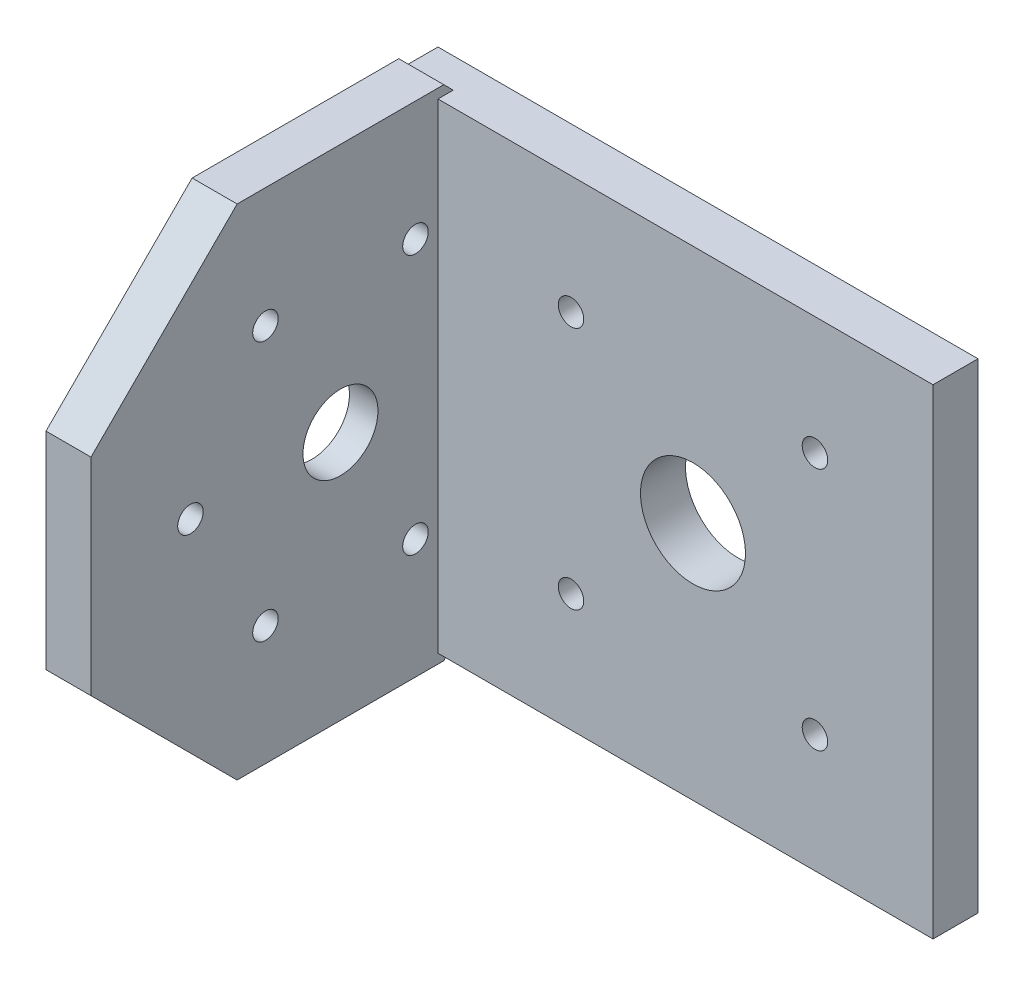
ISO-10303-21;
HEADER;
FILE_DESCRIPTION(('STEP AP214'),'2;1');
FILE_NAME('part.step','',(''),(''),'','','');
FILE_SCHEMA(('AUTOMOTIVE_DESIGN { 1 0 10303 214 1 1 1 1 }'));
ENDSEC;
DATA;
#1=APPLICATION_CONTEXT('core data for automotive mechanical design processes');
#2=APPLICATION_PROTOCOL_DEFINITION('international standard','automotive_design',2000,#1);
#3=PRODUCT_CONTEXT('',#1,'mechanical');
#4=PRODUCT('Part','Part','',(#3));
#5=PRODUCT_RELATED_PRODUCT_CATEGORY('part','',(#4));
#6=PRODUCT_DEFINITION_FORMATION('','',#4);
#7=PRODUCT_DEFINITION_CONTEXT('part definition',#1,'design');
#8=PRODUCT_DEFINITION('design','',#6,#7);
#9=PRODUCT_DEFINITION_SHAPE('','',#8);
#10=(LENGTH_UNIT() NAMED_UNIT(*) SI_UNIT(.MILLI.,.METRE.));
#11=(NAMED_UNIT(*) PLANE_ANGLE_UNIT() SI_UNIT($,.RADIAN.));
#12=(NAMED_UNIT(*) SI_UNIT($,.STERADIAN.) SOLID_ANGLE_UNIT());
#13=UNCERTAINTY_MEASURE_WITH_UNIT(LENGTH_MEASURE(1.E-05),#10,'distance_accuracy_value','');
#14=(GEOMETRIC_REPRESENTATION_CONTEXT(3) GLOBAL_UNCERTAINTY_ASSIGNED_CONTEXT((#13)) GLOBAL_UNIT_ASSIGNED_CONTEXT((#10,
#11,#12)) REPRESENTATION_CONTEXT('',''));
#15=CARTESIAN_POINT('',(0.,0.,0.));
#16=DIRECTION('',(0.,0.,1.));
#17=DIRECTION('',(1.,0.,0.));
#18=AXIS2_PLACEMENT_3D('',#15,#16,#17);
#19=CARTESIAN_POINT('',(-34.,0.,0.));
#20=DIRECTION('',(1.,0.,0.));
#21=DIRECTION('',(0.,0.,-1.));
#22=AXIS2_PLACEMENT_3D('',#19,#20,#21);
#23=PLANE('',#22);
#24=DIRECTION('',(0.,0.707106781186547,0.707106781186548));
#25=VECTOR('',#24,1.);
#26=CARTESIAN_POINT('',(-34.,13.7766035651432,-33.2596631704063));
#27=LINE('',#26,#25);
#28=CARTESIAN_POINT('',(-34.,13.7766035651432,-33.2596631704063));
#29=VERTEX_POINT('',#28);
#30=CARTESIAN_POINT('',(-34.,28.0362667355495,-19.));
#31=VERTEX_POINT('',#30);
#32=EDGE_CURVE('E147',#29,#31,#27,.T.);
#33=ORIENTED_EDGE('',*,*,#32,.T.);
#34=DIRECTION('',(0.,-1.,0.));
#35=VECTOR('',#34,1.);
#36=CARTESIAN_POINT('',(-34.,0.,-19.));
#37=LINE('',#36,#35);
#38=CARTESIAN_POINT('',(-34.,1.37477270848675,-19.));
#39=VERTEX_POINT('',#38);
#40=EDGE_CURVE('E269',#31,#39,#37,.T.);
#41=ORIENTED_EDGE('',*,*,#40,.T.);
#42=CARTESIAN_POINT('',(-34.,0.,-20.));
#43=DIRECTION('',(1.,0.,0.));
#44=DIRECTION('',(0.,0.,-1.));
#45=AXIS2_PLACEMENT_3D('',#42,#43,#44);
#46=CIRCLE('',#45,1.7);
#47=CARTESIAN_POINT('',(-34.,-1.37477270848675,-19.));
#48=VERTEX_POINT('',#47);
#49=EDGE_CURVE('E159',#48,#39,#46,.T.);
#50=ORIENTED_EDGE('',*,*,#49,.F.);
#51=CARTESIAN_POINT('',(-34.,-28.0362667355495,-19.));
#52=VERTEX_POINT('',#51);
#53=EDGE_CURVE('E54',#48,#52,#37,.T.);
#54=ORIENTED_EDGE('',*,*,#53,.T.);
#55=DIRECTION('',(0.,0.707106781186548,-0.707106781186547));
#56=VECTOR('',#55,1.);
#57=CARTESIAN_POINT('',(-34.,-33.2596631704063,-13.7766035651432));
#58=LINE('',#57,#56);
#59=CARTESIAN_POINT('',(-34.,-13.7766035651432,-33.2596631704063));
#60=VERTEX_POINT('',#59);
#61=EDGE_CURVE('E124',#52,#60,#58,.T.);
#62=ORIENTED_EDGE('',*,*,#61,.T.);
#63=DIRECTION('',(0.,1.,0.));
#64=VECTOR('',#63,1.);
#65=CARTESIAN_POINT('',(-34.,-13.7766035651432,-33.2596631704063));
#66=LINE('',#65,#64);
#67=EDGE_CURVE('E130',#60,#29,#66,.T.);
#68=ORIENTED_EDGE('',*,*,#67,.T.);
#69=EDGE_LOOP('',(#33,#41,#50,#54,#62,#68));
#70=FACE_BOUND('',#69,.T.);
#71=ADVANCED_FACE('F39',(#70),#23,.T.);
#72=CARTESIAN_POINT('',(-34.,0.,0.));
#73=DIRECTION('',(1.,0.,0.));
#74=DIRECTION('',(0.,0.,-1.));
#75=AXIS2_PLACEMENT_3D('',#72,#73,#74);
#76=CIRCLE('',#75,5.);
#77=CARTESIAN_POINT('',(-34.,0.,-5.));
#78=VERTEX_POINT('',#77);
#79=EDGE_CURVE('E284',#78,#78,#76,.T.);
#80=ORIENTED_EDGE('',*,*,#79,.F.);
#81=EDGE_LOOP('',(#80));
#82=FACE_BOUND('',#81,.T.);
#83=CARTESIAN_POINT('',(-34.,-17.3205080756888,10.));
#84=DIRECTION('',(1.,0.,0.));
#85=DIRECTION('',(0.,0.,-1.));
#86=AXIS2_PLACEMENT_3D('',#83,#84,#85);
#87=CIRCLE('',#86,1.7);
#88=CARTESIAN_POINT('',(-34.,-17.3205080756888,8.30000000000001));
#89=VERTEX_POINT('',#88);
#90=EDGE_CURVE('E292',#89,#89,#87,.T.);
#91=ORIENTED_EDGE('',*,*,#90,.F.);
#92=EDGE_LOOP('',(#91));
#93=FACE_BOUND('',#92,.T.);
#94=CARTESIAN_POINT('',(-34.,17.3205080756888,9.99999999999999));
#95=DIRECTION('',(1.,0.,0.));
#96=DIRECTION('',(0.,0.,-1.));
#97=AXIS2_PLACEMENT_3D('',#94,#95,#96);
#98=CIRCLE('',#97,1.7);
#99=CARTESIAN_POINT('',(-34.,17.3205080756888,8.3));
#100=VERTEX_POINT('',#99);
#101=EDGE_CURVE('E304',#100,#100,#98,.T.);
#102=ORIENTED_EDGE('',*,*,#101,.F.);
#103=EDGE_LOOP('',(#102));
#104=FACE_BOUND('',#103,.T.);
#105=CARTESIAN_POINT('',(-34.,17.3205080756888,-10.));
#106=DIRECTION('',(1.,0.,0.));
#107=DIRECTION('',(0.,0.,-1.));
#108=AXIS2_PLACEMENT_3D('',#105,#106,#107);
#109=CIRCLE('',#108,1.7);
#110=CARTESIAN_POINT('',(-34.,17.3205080756888,-11.7));
#111=VERTEX_POINT('',#110);
#112=EDGE_CURVE('E310',#111,#111,#109,.T.);
#113=ORIENTED_EDGE('',*,*,#112,.F.);
#114=EDGE_LOOP('',(#113));
#115=FACE_BOUND('',#114,.T.);
#116=CARTESIAN_POINT('',(-34.,0.,20.));
#117=DIRECTION('',(1.,0.,0.));
#118=DIRECTION('',(0.,0.,-1.));
#119=AXIS2_PLACEMENT_3D('',#116,#117,#118);
#120=CIRCLE('',#119,1.7);
#121=CARTESIAN_POINT('',(-34.,0.,18.3));
#122=VERTEX_POINT('',#121);
#123=EDGE_CURVE('E296',#122,#122,#120,.T.);
#124=ORIENTED_EDGE('',*,*,#123,.F.);
#125=EDGE_LOOP('',(#124));
#126=FACE_BOUND('',#125,.T.);
#127=CARTESIAN_POINT('',(-34.,-17.3205080756888,-10.));
#128=DIRECTION('',(1.,0.,0.));
#129=DIRECTION('',(0.,0.,-1.));
#130=AXIS2_PLACEMENT_3D('',#127,#128,#129);
#131=CIRCLE('',#130,1.7);
#132=CARTESIAN_POINT('',(-34.,-17.3205080756888,-11.7));
#133=VERTEX_POINT('',#132);
#134=EDGE_CURVE('E282',#133,#133,#131,.T.);
#135=ORIENTED_EDGE('',*,*,#134,.F.);
#136=EDGE_LOOP('',(#135));
#137=FACE_BOUND('',#136,.T.);
#138=CARTESIAN_POINT('',(-34.,-33.2596631704063,-13.7766035651432));
#139=VERTEX_POINT('',#138);
#140=CARTESIAN_POINT('',(-34.,-32.,-15.0362667355495));
#141=VERTEX_POINT('',#140);
#142=EDGE_CURVE('E135',#139,#141,#58,.T.);
#143=ORIENTED_EDGE('',*,*,#142,.T.);
#144=DIRECTION('',(0.,0.,1.));
#145=VECTOR('',#144,1.);
#146=CARTESIAN_POINT('',(-34.,-32.,0.));
#147=LINE('',#146,#145);
#148=CARTESIAN_POINT('',(-34.,-32.,-13.));
#149=VERTEX_POINT('',#148);
#150=EDGE_CURVE('E217',#141,#149,#147,.T.);
#151=ORIENTED_EDGE('',*,*,#150,.T.);
#152=DIRECTION('',(0.,-1.,0.));
#153=VECTOR('',#152,1.);
#154=CARTESIAN_POINT('',(-34.,0.,-13.));
#155=LINE('',#154,#153);
#156=CARTESIAN_POINT('',(-34.,32.,-13.));
#157=VERTEX_POINT('',#156);
#158=EDGE_CURVE('E220',#157,#149,#155,.T.);
#159=ORIENTED_EDGE('',*,*,#158,.F.);
#160=DIRECTION('',(0.,0.,-1.));
#161=VECTOR('',#160,1.);
#162=CARTESIAN_POINT('',(-34.,32.,0.));
#163=LINE('',#162,#161);
#164=CARTESIAN_POINT('',(-34.,32.,-15.0362667355495));
#165=VERTEX_POINT('',#164);
#166=EDGE_CURVE('E202',#157,#165,#163,.T.);
#167=ORIENTED_EDGE('',*,*,#166,.T.);
#168=CARTESIAN_POINT('',(-34.,33.2596631704063,-13.7766035651432));
#169=VERTEX_POINT('',#168);
#170=EDGE_CURVE('E63',#165,#169,#27,.T.);
#171=ORIENTED_EDGE('',*,*,#170,.T.);
#172=DIRECTION('',(0.,0.,1.));
#173=VECTOR('',#172,1.);
#174=CARTESIAN_POINT('',(-34.,33.2596631704063,-13.7766035651432));
#175=LINE('',#174,#173);
#176=CARTESIAN_POINT('',(-34.,33.2596631704063,13.7766035651432));
#177=VERTEX_POINT('',#176);
#178=EDGE_CURVE('E177',#169,#177,#175,.T.);
#179=ORIENTED_EDGE('',*,*,#178,.T.);
#180=DIRECTION('',(0.,-0.707106781186547,0.707106781186548));
#181=VECTOR('',#180,1.);
#182=CARTESIAN_POINT('',(-34.,33.2596631704063,13.7766035651432));
#183=LINE('',#182,#181);
#184=CARTESIAN_POINT('',(-34.,13.7766035651432,33.2596631704063));
#185=VERTEX_POINT('',#184);
#186=EDGE_CURVE('E110',#177,#185,#183,.T.);
#187=ORIENTED_EDGE('',*,*,#186,.T.);
#188=DIRECTION('',(0.,-1.,0.));
#189=VECTOR('',#188,1.);
#190=CARTESIAN_POINT('',(-34.,13.7766035651432,33.2596631704063));
#191=LINE('',#190,#189);
#192=CARTESIAN_POINT('',(-34.,-13.7766035651432,33.2596631704063));
#193=VERTEX_POINT('',#192);
#194=EDGE_CURVE('E226',#185,#193,#191,.T.);
#195=ORIENTED_EDGE('',*,*,#194,.T.);
#196=DIRECTION('',(0.,-0.707106781186548,-0.707106781186547));
#197=VECTOR('',#196,1.);
#198=CARTESIAN_POINT('',(-34.,-13.7766035651432,33.2596631704063));
#199=LINE('',#198,#197);
#200=CARTESIAN_POINT('',(-34.,-33.2596631704063,13.7766035651432));
#201=VERTEX_POINT('',#200);
#202=EDGE_CURVE('E231',#193,#201,#199,.T.);
#203=ORIENTED_EDGE('',*,*,#202,.T.);
#204=DIRECTION('',(0.,0.,-1.));
#205=VECTOR('',#204,1.);
#206=CARTESIAN_POINT('',(-34.,-33.2596631704063,13.7766035651432));
#207=LINE('',#206,#205);
#208=EDGE_CURVE('E133',#201,#139,#207,.T.);
#209=ORIENTED_EDGE('',*,*,#208,.T.);
#210=EDGE_LOOP('',(#143,#151,#159,#167,#171,#179,#187,#195,#203,#209));
#211=FACE_BOUND('',#210,.T.);
#212=ADVANCED_FACE('F212',(#82,#93,#104,#115,#126,#137,#211),#23,.T.);
#213=CARTESIAN_POINT('',(-34.,-33.2596631704063,-13.7766035651432));
#214=DIRECTION('',(0.,0.707106781186547,0.707106781186548));
#215=DIRECTION('',(0.,-0.707106781186548,0.707106781186547));
#216=AXIS2_PLACEMENT_3D('',#213,#214,#215);
#217=PLANE('',#216);
#218=DIRECTION('',(1.,0.,0.));
#219=VECTOR('',#218,1.);
#220=CARTESIAN_POINT('',(-34.,-28.0362667355495,-19.));
#221=LINE('',#220,#219);
#222=CARTESIAN_POINT('',(-40.,-28.0362667355495,-19.));
#223=VERTEX_POINT('',#222);
#224=EDGE_CURVE('E268',#223,#52,#221,.T.);
#225=ORIENTED_EDGE('',*,*,#224,.F.);
#226=DIRECTION('',(0.,0.707106781186548,-0.707106781186547));
#227=VECTOR('',#226,1.);
#228=CARTESIAN_POINT('',(-40.,-33.2596631704063,-13.7766035651432));
#229=LINE('',#228,#227);
#230=CARTESIAN_POINT('',(-40.,-13.7766035651432,-33.2596631704063));
#231=VERTEX_POINT('',#230);
#232=EDGE_CURVE('E138',#223,#231,#229,.T.);
#233=ORIENTED_EDGE('',*,*,#232,.T.);
#234=DIRECTION('',(-1.,0.,0.));
#235=VECTOR('',#234,1.);
#236=CARTESIAN_POINT('',(-34.,-13.7766035651432,-33.2596631704063));
#237=LINE('',#236,#235);
#238=EDGE_CURVE('E140',#60,#231,#237,.T.);
#239=ORIENTED_EDGE('',*,*,#238,.F.);
#240=ORIENTED_EDGE('',*,*,#61,.F.);
#241=EDGE_LOOP('',(#225,#233,#239,#240));
#242=FACE_BOUND('',#241,.T.);
#243=ADVANCED_FACE('F139',(#242),#217,.F.);
#244=DIRECTION('',(-1.,0.,0.));
#245=VECTOR('',#244,1.);
#246=CARTESIAN_POINT('',(-34.,-32.,-15.0362667355495));
#247=LINE('',#246,#245);
#248=CARTESIAN_POINT('',(-40.,-32.,-15.0362667355495));
#249=VERTEX_POINT('',#248);
#250=EDGE_CURVE('E11',#141,#249,#247,.T.);
#251=ORIENTED_EDGE('',*,*,#250,.F.);
#252=ORIENTED_EDGE('',*,*,#142,.F.);
#253=DIRECTION('',(-1.,0.,0.));
#254=VECTOR('',#253,1.);
#255=CARTESIAN_POINT('',(-34.,-33.2596631704063,-13.7766035651432));
#256=LINE('',#255,#254);
#257=CARTESIAN_POINT('',(-40.,-33.2596631704063,-13.7766035651432));
#258=VERTEX_POINT('',#257);
#259=EDGE_CURVE('E141',#139,#258,#256,.T.);
#260=ORIENTED_EDGE('',*,*,#259,.T.);
#261=EDGE_CURVE('E169',#258,#249,#229,.T.);
#262=ORIENTED_EDGE('',*,*,#261,.T.);
#263=EDGE_LOOP('',(#251,#252,#260,#262));
#264=FACE_BOUND('',#263,.T.);
#265=ADVANCED_FACE('F247',(#264),#217,.F.);
#266=CARTESIAN_POINT('',(-34.,13.7766035651432,-33.2596631704063));
#267=DIRECTION('',(0.,-0.707106781186548,0.707106781186547));
#268=DIRECTION('',(0.,-0.707106781186547,-0.707106781186548));
#269=AXIS2_PLACEMENT_3D('',#266,#267,#268);
#270=PLANE('',#269);
#271=DIRECTION('',(-1.,0.,0.));
#272=VECTOR('',#271,1.);
#273=CARTESIAN_POINT('',(-34.,28.0362667355495,-19.));
#274=LINE('',#273,#272);
#275=CARTESIAN_POINT('',(-40.,28.0362667355495,-19.));
#276=VERTEX_POINT('',#275);
#277=EDGE_CURVE('E218',#31,#276,#274,.T.);
#278=ORIENTED_EDGE('',*,*,#277,.F.);
#279=ORIENTED_EDGE('',*,*,#32,.F.);
#280=DIRECTION('',(-1.,0.,0.));
#281=VECTOR('',#280,1.);
#282=CARTESIAN_POINT('',(-34.,13.7766035651432,-33.2596631704063));
#283=LINE('',#282,#281);
#284=CARTESIAN_POINT('',(-40.,13.7766035651432,-33.2596631704063));
#285=VERTEX_POINT('',#284);
#286=EDGE_CURVE('E145',#29,#285,#283,.T.);
#287=ORIENTED_EDGE('',*,*,#286,.T.);
#288=DIRECTION('',(0.,0.707106781186547,0.707106781186548));
#289=VECTOR('',#288,1.);
#290=CARTESIAN_POINT('',(-40.,13.7766035651432,-33.2596631704063));
#291=LINE('',#290,#289);
#292=EDGE_CURVE('E175',#285,#276,#291,.T.);
#293=ORIENTED_EDGE('',*,*,#292,.T.);
#294=EDGE_LOOP('',(#278,#279,#287,#293));
#295=FACE_BOUND('',#294,.T.);
#296=ADVANCED_FACE('F385',(#295),#270,.F.);
#297=DIRECTION('',(1.,0.,0.));
#298=VECTOR('',#297,1.);
#299=CARTESIAN_POINT('',(-34.,32.,-15.0362667355495));
#300=LINE('',#299,#298);
#301=CARTESIAN_POINT('',(-40.,32.,-15.0362667355495));
#302=VERTEX_POINT('',#301);
#303=EDGE_CURVE('E48',#302,#165,#300,.T.);
#304=ORIENTED_EDGE('',*,*,#303,.F.);
#305=CARTESIAN_POINT('',(-40.,33.2596631704063,-13.7766035651432));
#306=VERTEX_POINT('',#305);
#307=EDGE_CURVE('E98',#302,#306,#291,.T.);
#308=ORIENTED_EDGE('',*,*,#307,.T.);
#309=DIRECTION('',(-1.,0.,0.));
#310=VECTOR('',#309,1.);
#311=CARTESIAN_POINT('',(-34.,33.2596631704063,-13.7766035651432));
#312=LINE('',#311,#310);
#313=EDGE_CURVE('E154',#169,#306,#312,.T.);
#314=ORIENTED_EDGE('',*,*,#313,.F.);
#315=ORIENTED_EDGE('',*,*,#170,.F.);
#316=EDGE_LOOP('',(#304,#308,#314,#315));
#317=FACE_BOUND('',#316,.T.);
#318=ADVANCED_FACE('F222',(#317),#270,.F.);
#319=CARTESIAN_POINT('',(-34.,0.,-20.));
#320=DIRECTION('',(-1.,0.,0.));
#321=DIRECTION('',(0.,0.,1.));
#322=AXIS2_PLACEMENT_3D('',#319,#320,#321);
#323=CYLINDRICAL_SURFACE('',#322,1.7);
#324=ORIENTED_EDGE('',*,*,#49,.T.);
#325=DIRECTION('',(-1.,0.,0.));
#326=VECTOR('',#325,1.);
#327=CARTESIAN_POINT('',(-34.,1.37477270848675,-19.));
#328=LINE('',#327,#326);
#329=CARTESIAN_POINT('',(-40.,1.37477270848675,-19.));
#330=VERTEX_POINT('',#329);
#331=EDGE_CURVE('E191',#39,#330,#328,.T.);
#332=ORIENTED_EDGE('',*,*,#331,.T.);
#333=CARTESIAN_POINT('',(-40.,0.,-20.));
#334=DIRECTION('',(1.,0.,0.));
#335=DIRECTION('',(0.,0.,-1.));
#336=AXIS2_PLACEMENT_3D('',#333,#334,#335);
#337=CIRCLE('',#336,1.7);
#338=CARTESIAN_POINT('',(-40.,-1.37477270848675,-19.));
#339=VERTEX_POINT('',#338);
#340=EDGE_CURVE('E227',#339,#330,#337,.T.);
#341=ORIENTED_EDGE('',*,*,#340,.F.);
#342=DIRECTION('',(-1.,0.,0.));
#343=VECTOR('',#342,1.);
#344=CARTESIAN_POINT('',(-34.,-1.37477270848675,-19.));
#345=LINE('',#344,#343);
#346=EDGE_CURVE('E195',#339,#48,#345,.F.);
#347=ORIENTED_EDGE('',*,*,#346,.T.);
#348=EDGE_LOOP('',(#324,#332,#341,#347));
#349=FACE_BOUND('',#348,.T.);
#350=ADVANCED_FACE('F326',(#349),#323,.F.);
#351=CARTESIAN_POINT('',(-40.,0.,0.));
#352=DIRECTION('',(1.,0.,0.));
#353=DIRECTION('',(0.,0.,-1.));
#354=AXIS2_PLACEMENT_3D('',#351,#352,#353);
#355=PLANE('',#354);
#356=CARTESIAN_POINT('',(-40.,0.,0.));
#357=DIRECTION('',(1.,0.,0.));
#358=DIRECTION('',(0.,0.,-1.));
#359=AXIS2_PLACEMENT_3D('',#356,#357,#358);
#360=CIRCLE('',#359,15.15);
#361=CARTESIAN_POINT('',(-40.,0.,-15.15));
#362=VERTEX_POINT('',#361);
#363=EDGE_CURVE('E411',#362,#362,#360,.T.);
#364=ORIENTED_EDGE('',*,*,#363,.T.);
#365=EDGE_LOOP('',(#364));
#366=FACE_BOUND('',#365,.T.);
#367=ORIENTED_EDGE('',*,*,#340,.T.);
#368=DIRECTION('',(0.,-1.,0.));
#369=VECTOR('',#368,1.);
#370=CARTESIAN_POINT('',(-40.,32.,-19.));
#371=LINE('',#370,#369);
#372=EDGE_CURVE('E323',#330,#339,#371,.T.);
#373=ORIENTED_EDGE('',*,*,#372,.T.);
#374=EDGE_LOOP('',(#367,#373));
#375=FACE_BOUND('',#374,.T.);
#376=ORIENTED_EDGE('',*,*,#232,.F.);
#377=CARTESIAN_POINT('',(-40.,-32.,-19.));
#378=VERTEX_POINT('',#377);
#379=EDGE_CURVE('E262',#223,#378,#371,.T.);
#380=ORIENTED_EDGE('',*,*,#379,.T.);
#381=DIRECTION('',(0.,0.,-1.));
#382=VECTOR('',#381,1.);
#383=CARTESIAN_POINT('',(-40.,-32.,-13.));
#384=LINE('',#383,#382);
#385=EDGE_CURVE('E254',#249,#378,#384,.T.);
#386=ORIENTED_EDGE('',*,*,#385,.F.);
#387=ORIENTED_EDGE('',*,*,#261,.F.);
#388=DIRECTION('',(0.,0.,-1.));
#389=VECTOR('',#388,1.);
#390=CARTESIAN_POINT('',(-40.,-33.2596631704063,13.7766035651432));
#391=LINE('',#390,#389);
#392=CARTESIAN_POINT('',(-40.,-33.2596631704063,13.7766035651432));
#393=VERTEX_POINT('',#392);
#394=EDGE_CURVE('E167',#393,#258,#391,.T.);
#395=ORIENTED_EDGE('',*,*,#394,.F.);
#396=DIRECTION('',(0.,-0.707106781186548,-0.707106781186547));
#397=VECTOR('',#396,1.);
#398=CARTESIAN_POINT('',(-40.,-13.7766035651432,33.2596631704063));
#399=LINE('',#398,#397);
#400=CARTESIAN_POINT('',(-40.,-13.7766035651432,33.2596631704063));
#401=VERTEX_POINT('',#400);
#402=EDGE_CURVE('E163',#401,#393,#399,.T.);
#403=ORIENTED_EDGE('',*,*,#402,.F.);
#404=DIRECTION('',(0.,-1.,0.));
#405=VECTOR('',#404,1.);
#406=CARTESIAN_POINT('',(-40.,13.7766035651432,33.2596631704063));
#407=LINE('',#406,#405);
#408=CARTESIAN_POINT('',(-40.,13.7766035651432,33.2596631704063));
#409=VERTEX_POINT('',#408);
#410=EDGE_CURVE('E165',#409,#401,#407,.T.);
#411=ORIENTED_EDGE('',*,*,#410,.F.);
#412=DIRECTION('',(0.,-0.707106781186547,0.707106781186548));
#413=VECTOR('',#412,1.);
#414=CARTESIAN_POINT('',(-40.,33.2596631704063,13.7766035651432));
#415=LINE('',#414,#413);
#416=CARTESIAN_POINT('',(-40.,33.2596631704063,13.7766035651432));
#417=VERTEX_POINT('',#416);
#418=EDGE_CURVE('E157',#417,#409,#415,.T.);
#419=ORIENTED_EDGE('',*,*,#418,.F.);
#420=DIRECTION('',(0.,0.,1.));
#421=VECTOR('',#420,1.);
#422=CARTESIAN_POINT('',(-40.,33.2596631704063,-13.7766035651432));
#423=LINE('',#422,#421);
#424=EDGE_CURVE('E156',#306,#417,#423,.T.);
#425=ORIENTED_EDGE('',*,*,#424,.F.);
#426=ORIENTED_EDGE('',*,*,#307,.F.);
#427=DIRECTION('',(0.,0.,-1.));
#428=VECTOR('',#427,1.);
#429=CARTESIAN_POINT('',(-40.,32.,-13.));
#430=LINE('',#429,#428);
#431=CARTESIAN_POINT('',(-40.,32.,-19.));
#432=VERTEX_POINT('',#431);
#433=EDGE_CURVE('E209',#302,#432,#430,.T.);
#434=ORIENTED_EDGE('',*,*,#433,.T.);
#435=EDGE_CURVE('E356',#432,#276,#371,.T.);
#436=ORIENTED_EDGE('',*,*,#435,.T.);
#437=ORIENTED_EDGE('',*,*,#292,.F.);
#438=DIRECTION('',(0.,1.,0.));
#439=VECTOR('',#438,1.);
#440=CARTESIAN_POINT('',(-40.,-13.7766035651432,-33.2596631704063));
#441=LINE('',#440,#439);
#442=EDGE_CURVE('E174',#231,#285,#441,.T.);
#443=ORIENTED_EDGE('',*,*,#442,.F.);
#444=EDGE_LOOP('',(#376,#380,#386,#387,#395,#403,#411,#419,#425,#426,#434,#436,#437,#443));
#445=FACE_BOUND('',#444,.T.);
#446=CARTESIAN_POINT('',(-40.,17.3205080756888,-10.));
#447=DIRECTION('',(1.,0.,0.));
#448=DIRECTION('',(0.,0.,-1.));
#449=AXIS2_PLACEMENT_3D('',#446,#447,#448);
#450=CIRCLE('',#449,1.7);
#451=CARTESIAN_POINT('',(-40.,17.3205080756888,-11.7));
#452=VERTEX_POINT('',#451);
#453=EDGE_CURVE('E308',#452,#452,#450,.T.);
#454=ORIENTED_EDGE('',*,*,#453,.T.);
#455=EDGE_LOOP('',(#454));
#456=FACE_BOUND('',#455,.T.);
#457=CARTESIAN_POINT('',(-40.,17.3205080756888,9.99999999999999));
#458=DIRECTION('',(1.,0.,0.));
#459=DIRECTION('',(0.,0.,-1.));
#460=AXIS2_PLACEMENT_3D('',#457,#458,#459);
#461=CIRCLE('',#460,1.7);
#462=CARTESIAN_POINT('',(-40.,17.3205080756888,8.3));
#463=VERTEX_POINT('',#462);
#464=EDGE_CURVE('E297',#463,#463,#461,.T.);
#465=ORIENTED_EDGE('',*,*,#464,.T.);
#466=EDGE_LOOP('',(#465));
#467=FACE_BOUND('',#466,.T.);
#468=CARTESIAN_POINT('',(-40.,0.,20.));
#469=DIRECTION('',(1.,0.,0.));
#470=DIRECTION('',(0.,0.,-1.));
#471=AXIS2_PLACEMENT_3D('',#468,#469,#470);
#472=CIRCLE('',#471,1.7);
#473=CARTESIAN_POINT('',(-40.,0.,18.3));
#474=VERTEX_POINT('',#473);
#475=EDGE_CURVE('E294',#474,#474,#472,.T.);
#476=ORIENTED_EDGE('',*,*,#475,.T.);
#477=EDGE_LOOP('',(#476));
#478=FACE_BOUND('',#477,.T.);
#479=CARTESIAN_POINT('',(-40.,-17.3205080756888,10.));
#480=DIRECTION('',(1.,0.,0.));
#481=DIRECTION('',(0.,0.,-1.));
#482=AXIS2_PLACEMENT_3D('',#479,#480,#481);
#483=CIRCLE('',#482,1.7);
#484=CARTESIAN_POINT('',(-40.,-17.3205080756888,8.30000000000001));
#485=VERTEX_POINT('',#484);
#486=EDGE_CURVE('E289',#485,#485,#483,.T.);
#487=ORIENTED_EDGE('',*,*,#486,.T.);
#488=EDGE_LOOP('',(#487));
#489=FACE_BOUND('',#488,.T.);
#490=CARTESIAN_POINT('',(-40.,-17.3205080756888,-10.));
#491=DIRECTION('',(1.,0.,0.));
#492=DIRECTION('',(0.,0.,-1.));
#493=AXIS2_PLACEMENT_3D('',#490,#491,#492);
#494=CIRCLE('',#493,1.7);
#495=CARTESIAN_POINT('',(-40.,-17.3205080756888,-11.7));
#496=VERTEX_POINT('',#495);
#497=EDGE_CURVE('E283',#496,#496,#494,.T.);
#498=ORIENTED_EDGE('',*,*,#497,.T.);
#499=EDGE_LOOP('',(#498));
#500=FACE_BOUND('',#499,.T.);
#501=ADVANCED_FACE('F261',(#366,#375,#445,#456,#467,#478,#489,#500),#355,.F.);
#502=CARTESIAN_POINT('',(-34.,33.2596631704063,-13.7766035651432));
#503=DIRECTION('',(0.,-1.,0.));
#504=DIRECTION('',(0.,0.,-1.));
#505=AXIS2_PLACEMENT_3D('',#502,#503,#504);
#506=PLANE('',#505);
#507=ORIENTED_EDGE('',*,*,#424,.T.);
#508=DIRECTION('',(-1.,0.,0.));
#509=VECTOR('',#508,1.);
#510=CARTESIAN_POINT('',(-34.,33.2596631704063,13.7766035651432));
#511=LINE('',#510,#509);
#512=EDGE_CURVE('E187',#177,#417,#511,.T.);
#513=ORIENTED_EDGE('',*,*,#512,.F.);
#514=ORIENTED_EDGE('',*,*,#178,.F.);
#515=ORIENTED_EDGE('',*,*,#313,.T.);
#516=EDGE_LOOP('',(#507,#513,#514,#515));
#517=FACE_BOUND('',#516,.T.);
#518=ADVANCED_FACE('F41',(#517),#506,.F.);
#519=CARTESIAN_POINT('',(-34.,33.2596631704063,13.7766035651432));
#520=DIRECTION('',(0.,-0.707106781186548,-0.707106781186548));
#521=DIRECTION('',(0.,0.707106781186548,-0.707106781186548));
#522=AXIS2_PLACEMENT_3D('',#519,#520,#521);
#523=PLANE('',#522);
#524=ORIENTED_EDGE('',*,*,#418,.T.);
#525=DIRECTION('',(-1.,0.,0.));
#526=VECTOR('',#525,1.);
#527=CARTESIAN_POINT('',(-34.,13.7766035651432,33.2596631704063));
#528=LINE('',#527,#526);
#529=EDGE_CURVE('E186',#185,#409,#528,.T.);
#530=ORIENTED_EDGE('',*,*,#529,.F.);
#531=ORIENTED_EDGE('',*,*,#186,.F.);
#532=ORIENTED_EDGE('',*,*,#512,.T.);
#533=EDGE_LOOP('',(#524,#530,#531,#532));
#534=FACE_BOUND('',#533,.T.);
#535=ADVANCED_FACE('F458',(#534),#523,.F.);
#536=CARTESIAN_POINT('',(-34.,13.7766035651432,33.2596631704063));
#537=DIRECTION('',(0.,0.,-1.));
#538=DIRECTION('',(-1.,0.,0.));
#539=AXIS2_PLACEMENT_3D('',#536,#537,#538);
#540=PLANE('',#539);
#541=ORIENTED_EDGE('',*,*,#410,.T.);
#542=DIRECTION('',(-1.,0.,0.));
#543=VECTOR('',#542,1.);
#544=CARTESIAN_POINT('',(-34.,-13.7766035651432,33.2596631704063));
#545=LINE('',#544,#543);
#546=EDGE_CURVE('E184',#193,#401,#545,.T.);
#547=ORIENTED_EDGE('',*,*,#546,.F.);
#548=ORIENTED_EDGE('',*,*,#194,.F.);
#549=ORIENTED_EDGE('',*,*,#529,.T.);
#550=EDGE_LOOP('',(#541,#547,#548,#549));
#551=FACE_BOUND('',#550,.T.);
#552=ADVANCED_FACE('F663',(#551),#540,.F.);
#553=CARTESIAN_POINT('',(-34.,-13.7766035651432,33.2596631704063));
#554=DIRECTION('',(0.,0.707106781186547,-0.707106781186548));
#555=DIRECTION('',(0.,0.707106781186548,0.707106781186547));
#556=AXIS2_PLACEMENT_3D('',#553,#554,#555);
#557=PLANE('',#556);
#558=ORIENTED_EDGE('',*,*,#402,.T.);
#559=DIRECTION('',(-1.,0.,0.));
#560=VECTOR('',#559,1.);
#561=CARTESIAN_POINT('',(-34.,-33.2596631704063,13.7766035651432));
#562=LINE('',#561,#560);
#563=EDGE_CURVE('E182',#201,#393,#562,.T.);
#564=ORIENTED_EDGE('',*,*,#563,.F.);
#565=ORIENTED_EDGE('',*,*,#202,.F.);
#566=ORIENTED_EDGE('',*,*,#546,.T.);
#567=EDGE_LOOP('',(#558,#564,#565,#566));
#568=FACE_BOUND('',#567,.T.);
#569=ADVANCED_FACE('F674',(#568),#557,.F.);
#570=CARTESIAN_POINT('',(-34.,-33.2596631704063,13.7766035651432));
#571=DIRECTION('',(0.,1.,0.));
#572=DIRECTION('',(0.,0.,1.));
#573=AXIS2_PLACEMENT_3D('',#570,#571,#572);
#574=PLANE('',#573);
#575=ORIENTED_EDGE('',*,*,#394,.T.);
#576=ORIENTED_EDGE('',*,*,#259,.F.);
#577=ORIENTED_EDGE('',*,*,#208,.F.);
#578=ORIENTED_EDGE('',*,*,#563,.T.);
#579=EDGE_LOOP('',(#575,#576,#577,#578));
#580=FACE_BOUND('',#579,.T.);
#581=ADVANCED_FACE('F244',(#580),#574,.F.);
#582=CARTESIAN_POINT('',(-34.,-13.7766035651432,-33.2596631704063));
#583=DIRECTION('',(0.,0.,1.));
#584=DIRECTION('',(0.,-1.,0.));
#585=AXIS2_PLACEMENT_3D('',#582,#583,#584);
#586=PLANE('',#585);
#587=ORIENTED_EDGE('',*,*,#442,.T.);
#588=ORIENTED_EDGE('',*,*,#286,.F.);
#589=ORIENTED_EDGE('',*,*,#67,.F.);
#590=ORIENTED_EDGE('',*,*,#238,.T.);
#591=EDGE_LOOP('',(#587,#588,#589,#590));
#592=FACE_BOUND('',#591,.T.);
#593=ADVANCED_FACE('F148',(#592),#586,.F.);
#594=CARTESIAN_POINT('',(-34.,17.3205080756888,-10.));
#595=DIRECTION('',(-1.,0.,0.));
#596=DIRECTION('',(0.,0.,1.));
#597=AXIS2_PLACEMENT_3D('',#594,#595,#596);
#598=CYLINDRICAL_SURFACE('',#597,1.7);
#599=ORIENTED_EDGE('',*,*,#112,.T.);
#600=EDGE_LOOP('',(#599));
#601=FACE_BOUND('',#600,.T.);
#602=ORIENTED_EDGE('',*,*,#453,.F.);
#603=EDGE_LOOP('',(#602));
#604=FACE_BOUND('',#603,.T.);
#605=ADVANCED_FACE('F469',(#601,#604),#598,.F.);
#606=CARTESIAN_POINT('',(-34.,17.3205080756888,9.99999999999999));
#607=DIRECTION('',(-1.,0.,0.));
#608=DIRECTION('',(0.,0.,1.));
#609=AXIS2_PLACEMENT_3D('',#606,#607,#608);
#610=CYLINDRICAL_SURFACE('',#609,1.7);
#611=ORIENTED_EDGE('',*,*,#101,.T.);
#612=EDGE_LOOP('',(#611));
#613=FACE_BOUND('',#612,.T.);
#614=ORIENTED_EDGE('',*,*,#464,.F.);
#615=EDGE_LOOP('',(#614));
#616=FACE_BOUND('',#615,.T.);
#617=ADVANCED_FACE('F473',(#613,#616),#610,.F.);
#618=CARTESIAN_POINT('',(-34.,0.,20.));
#619=DIRECTION('',(-1.,0.,0.));
#620=DIRECTION('',(0.,0.,1.));
#621=AXIS2_PLACEMENT_3D('',#618,#619,#620);
#622=CYLINDRICAL_SURFACE('',#621,1.7);
#623=ORIENTED_EDGE('',*,*,#123,.T.);
#624=EDGE_LOOP('',(#623));
#625=FACE_BOUND('',#624,.T.);
#626=ORIENTED_EDGE('',*,*,#475,.F.);
#627=EDGE_LOOP('',(#626));
#628=FACE_BOUND('',#627,.T.);
#629=ADVANCED_FACE('F474',(#625,#628),#622,.F.);
#630=CARTESIAN_POINT('',(-34.,-17.3205080756888,10.));
#631=DIRECTION('',(-1.,0.,0.));
#632=DIRECTION('',(0.,0.,1.));
#633=AXIS2_PLACEMENT_3D('',#630,#631,#632);
#634=CYLINDRICAL_SURFACE('',#633,1.7);
#635=ORIENTED_EDGE('',*,*,#90,.T.);
#636=EDGE_LOOP('',(#635));
#637=FACE_BOUND('',#636,.T.);
#638=ORIENTED_EDGE('',*,*,#486,.F.);
#639=EDGE_LOOP('',(#638));
#640=FACE_BOUND('',#639,.T.);
#641=ADVANCED_FACE('F448',(#637,#640),#634,.F.);
#642=CARTESIAN_POINT('',(-34.,-17.3205080756888,-10.));
#643=DIRECTION('',(-1.,0.,0.));
#644=DIRECTION('',(0.,0.,1.));
#645=AXIS2_PLACEMENT_3D('',#642,#643,#644);
#646=CYLINDRICAL_SURFACE('',#645,1.7);
#647=ORIENTED_EDGE('',*,*,#134,.T.);
#648=EDGE_LOOP('',(#647));
#649=FACE_BOUND('',#648,.T.);
#650=ORIENTED_EDGE('',*,*,#497,.F.);
#651=EDGE_LOOP('',(#650));
#652=FACE_BOUND('',#651,.T.);
#653=ADVANCED_FACE('F429',(#649,#652),#646,.F.);
#654=CARTESIAN_POINT('',(-34.,0.,0.));
#655=DIRECTION('',(-1.,0.,0.));
#656=DIRECTION('',(0.,0.,1.));
#657=AXIS2_PLACEMENT_3D('',#654,#655,#656);
#658=CYLINDRICAL_SURFACE('',#657,5.);
#659=CARTESIAN_POINT('',(-37.8,0.,0.));
#660=DIRECTION('',(1.,0.,0.));
#661=DIRECTION('',(0.,0.,-1.));
#662=AXIS2_PLACEMENT_3D('',#659,#660,#661);
#663=CIRCLE('',#662,5.);
#664=CARTESIAN_POINT('',(-37.8,0.,-5.));
#665=VERTEX_POINT('',#664);
#666=EDGE_CURVE('E43',#665,#665,#663,.T.);
#667=ORIENTED_EDGE('',*,*,#666,.F.);
#668=EDGE_LOOP('',(#667));
#669=FACE_BOUND('',#668,.T.);
#670=ORIENTED_EDGE('',*,*,#79,.T.);
#671=EDGE_LOOP('',(#670));
#672=FACE_BOUND('',#671,.T.);
#673=ADVANCED_FACE('F430',(#669,#672),#658,.F.);
#674=CARTESIAN_POINT('',(0.,0.,-19.));
#675=DIRECTION('',(0.,0.,1.));
#676=DIRECTION('',(1.,0.,0.));
#677=AXIS2_PLACEMENT_3D('',#674,#675,#676);
#678=PLANE('',#677);
#679=CARTESIAN_POINT('',(16.2634559672906,16.2634559672906,-19.));
#680=DIRECTION('',(0.,0.,1.));
#681=DIRECTION('',(1.,0.,0.));
#682=AXIS2_PLACEMENT_3D('',#679,#680,#681);
#683=CIRCLE('',#682,1.7);
#684=CARTESIAN_POINT('',(17.9634559672906,16.2634559672906,-19.));
#685=VERTEX_POINT('',#684);
#686=EDGE_CURVE('E352',#685,#685,#683,.T.);
#687=ORIENTED_EDGE('',*,*,#686,.T.);
#688=EDGE_LOOP('',(#687));
#689=FACE_BOUND('',#688,.T.);
#690=CARTESIAN_POINT('',(-16.2634559672906,16.2634559672906,-19.));
#691=DIRECTION('',(0.,0.,1.));
#692=DIRECTION('',(1.,0.,0.));
#693=AXIS2_PLACEMENT_3D('',#690,#691,#692);
#694=CIRCLE('',#693,1.7);
#695=CARTESIAN_POINT('',(-14.5634559672906,16.2634559672906,-19.));
#696=VERTEX_POINT('',#695);
#697=EDGE_CURVE('E394',#696,#696,#694,.T.);
#698=ORIENTED_EDGE('',*,*,#697,.T.);
#699=EDGE_LOOP('',(#698));
#700=FACE_BOUND('',#699,.T.);
#701=CARTESIAN_POINT('',(-16.2634559672906,-16.2634559672906,-19.));
#702=DIRECTION('',(0.,0.,1.));
#703=DIRECTION('',(1.,0.,0.));
#704=AXIS2_PLACEMENT_3D('',#701,#702,#703);
#705=CIRCLE('',#704,1.7);
#706=CARTESIAN_POINT('',(-14.5634559672906,-16.2634559672906,-19.));
#707=VERTEX_POINT('',#706);
#708=EDGE_CURVE('E400',#707,#707,#705,.T.);
#709=ORIENTED_EDGE('',*,*,#708,.T.);
#710=EDGE_LOOP('',(#709));
#711=FACE_BOUND('',#710,.T.);
#712=CARTESIAN_POINT('',(16.2634559672906,-16.2634559672906,-19.));
#713=DIRECTION('',(0.,0.,1.));
#714=DIRECTION('',(1.,0.,0.));
#715=AXIS2_PLACEMENT_3D('',#712,#713,#714);
#716=CIRCLE('',#715,1.7);
#717=CARTESIAN_POINT('',(17.9634559672906,-16.2634559672906,-19.));
#718=VERTEX_POINT('',#717);
#719=EDGE_CURVE('E401',#718,#718,#716,.T.);
#720=ORIENTED_EDGE('',*,*,#719,.T.);
#721=EDGE_LOOP('',(#720));
#722=FACE_BOUND('',#721,.T.);
#723=CARTESIAN_POINT('',(0.,0.,-19.));
#724=DIRECTION('',(0.,0.,1.));
#725=DIRECTION('',(1.,0.,0.));
#726=AXIS2_PLACEMENT_3D('',#723,#724,#725);
#727=CIRCLE('',#726,7.);
#728=CARTESIAN_POINT('',(7.,0.,-19.));
#729=VERTEX_POINT('',#728);
#730=EDGE_CURVE('E408',#729,#729,#727,.T.);
#731=ORIENTED_EDGE('',*,*,#730,.T.);
#732=EDGE_LOOP('',(#731));
#733=FACE_BOUND('',#732,.T.);
#734=ORIENTED_EDGE('',*,*,#40,.F.);
#735=ORIENTED_EDGE('',*,*,#277,.T.);
#736=ORIENTED_EDGE('',*,*,#435,.F.);
#737=DIRECTION('',(-1.,0.,0.));
#738=VECTOR('',#737,1.);
#739=CARTESIAN_POINT('',(32.,32.,-19.));
#740=LINE('',#739,#738);
#741=CARTESIAN_POINT('',(32.,32.,-19.));
#742=VERTEX_POINT('',#741);
#743=EDGE_CURVE('E349',#742,#432,#740,.T.);
#744=ORIENTED_EDGE('',*,*,#743,.F.);
#745=DIRECTION('',(0.,1.,0.));
#746=VECTOR('',#745,1.);
#747=CARTESIAN_POINT('',(32.,-32.,-19.));
#748=LINE('',#747,#746);
#749=CARTESIAN_POINT('',(32.,-32.,-19.));
#750=VERTEX_POINT('',#749);
#751=EDGE_CURVE('E351',#750,#742,#748,.T.);
#752=ORIENTED_EDGE('',*,*,#751,.F.);
#753=DIRECTION('',(1.,0.,0.));
#754=VECTOR('',#753,1.);
#755=CARTESIAN_POINT('',(-40.,-32.,-19.));
#756=LINE('',#755,#754);
#757=EDGE_CURVE('E362',#378,#750,#756,.T.);
#758=ORIENTED_EDGE('',*,*,#757,.F.);
#759=ORIENTED_EDGE('',*,*,#379,.F.);
#760=ORIENTED_EDGE('',*,*,#224,.T.);
#761=ORIENTED_EDGE('',*,*,#53,.F.);
#762=ORIENTED_EDGE('',*,*,#346,.F.);
#763=ORIENTED_EDGE('',*,*,#372,.F.);
#764=ORIENTED_EDGE('',*,*,#331,.F.);
#765=EDGE_LOOP('',(#734,#735,#736,#744,#752,#758,#759,#760,#761,#762,#763,#764));
#766=FACE_BOUND('',#765,.T.);
#767=ADVANCED_FACE('F380',(#689,#700,#711,#722,#733,#766),#678,.F.);
#768=CARTESIAN_POINT('',(0.,0.,-13.));
#769=DIRECTION('',(0.,0.,1.));
#770=DIRECTION('',(1.,0.,0.));
#771=AXIS2_PLACEMENT_3D('',#768,#769,#770);
#772=PLANE('',#771);
#773=CARTESIAN_POINT('',(16.2634559672906,-16.2634559672906,-13.));
#774=DIRECTION('',(0.,0.,1.));
#775=DIRECTION('',(1.,0.,0.));
#776=AXIS2_PLACEMENT_3D('',#773,#774,#775);
#777=CIRCLE('',#776,1.7);
#778=CARTESIAN_POINT('',(17.9634559672906,-16.2634559672906,-13.));
#779=VERTEX_POINT('',#778);
#780=EDGE_CURVE('E398',#779,#779,#777,.T.);
#781=ORIENTED_EDGE('',*,*,#780,.F.);
#782=EDGE_LOOP('',(#781));
#783=FACE_BOUND('',#782,.T.);
#784=CARTESIAN_POINT('',(-16.2634559672906,16.2634559672906,-13.));
#785=DIRECTION('',(0.,0.,1.));
#786=DIRECTION('',(1.,0.,0.));
#787=AXIS2_PLACEMENT_3D('',#784,#785,#786);
#788=CIRCLE('',#787,1.7);
#789=CARTESIAN_POINT('',(-14.5634559672906,16.2634559672906,-13.));
#790=VERTEX_POINT('',#789);
#791=EDGE_CURVE('E386',#790,#790,#788,.T.);
#792=ORIENTED_EDGE('',*,*,#791,.F.);
#793=EDGE_LOOP('',(#792));
#794=FACE_BOUND('',#793,.T.);
#795=DIRECTION('',(-1.,0.,0.));
#796=VECTOR('',#795,1.);
#797=CARTESIAN_POINT('',(32.,32.,-13.));
#798=LINE('',#797,#796);
#799=CARTESIAN_POINT('',(32.,32.,-13.));
#800=VERTEX_POINT('',#799);
#801=EDGE_CURVE('E347',#800,#157,#798,.T.);
#802=ORIENTED_EDGE('',*,*,#801,.T.);
#803=ORIENTED_EDGE('',*,*,#158,.T.);
#804=DIRECTION('',(1.,0.,0.));
#805=VECTOR('',#804,1.);
#806=CARTESIAN_POINT('',(-40.,-32.,-13.));
#807=LINE('',#806,#805);
#808=CARTESIAN_POINT('',(32.,-32.,-13.));
#809=VERTEX_POINT('',#808);
#810=EDGE_CURVE('E341',#149,#809,#807,.T.);
#811=ORIENTED_EDGE('',*,*,#810,.T.);
#812=DIRECTION('',(0.,1.,0.));
#813=VECTOR('',#812,1.);
#814=CARTESIAN_POINT('',(32.,-32.,-13.));
#815=LINE('',#814,#813);
#816=EDGE_CURVE('E346',#809,#800,#815,.T.);
#817=ORIENTED_EDGE('',*,*,#816,.T.);
#818=EDGE_LOOP('',(#802,#803,#811,#817));
#819=FACE_BOUND('',#818,.T.);
#820=CARTESIAN_POINT('',(16.2634559672906,16.2634559672906,-13.));
#821=DIRECTION('',(0.,0.,1.));
#822=DIRECTION('',(1.,0.,0.));
#823=AXIS2_PLACEMENT_3D('',#820,#821,#822);
#824=CIRCLE('',#823,1.7);
#825=CARTESIAN_POINT('',(17.9634559672906,16.2634559672906,-13.));
#826=VERTEX_POINT('',#825);
#827=EDGE_CURVE('E383',#826,#826,#824,.T.);
#828=ORIENTED_EDGE('',*,*,#827,.F.);
#829=EDGE_LOOP('',(#828));
#830=FACE_BOUND('',#829,.T.);
#831=CARTESIAN_POINT('',(-16.2634559672906,-16.2634559672906,-13.));
#832=DIRECTION('',(0.,0.,1.));
#833=DIRECTION('',(1.,0.,0.));
#834=AXIS2_PLACEMENT_3D('',#831,#832,#833);
#835=CIRCLE('',#834,1.7);
#836=CARTESIAN_POINT('',(-14.5634559672906,-16.2634559672906,-13.));
#837=VERTEX_POINT('',#836);
#838=EDGE_CURVE('E393',#837,#837,#835,.T.);
#839=ORIENTED_EDGE('',*,*,#838,.F.);
#840=EDGE_LOOP('',(#839));
#841=FACE_BOUND('',#840,.T.);
#842=CARTESIAN_POINT('',(0.,0.,-13.));
#843=DIRECTION('',(0.,0.,1.));
#844=DIRECTION('',(1.,0.,0.));
#845=AXIS2_PLACEMENT_3D('',#842,#843,#844);
#846=CIRCLE('',#845,7.);
#847=CARTESIAN_POINT('',(7.,0.,-13.));
#848=VERTEX_POINT('',#847);
#849=EDGE_CURVE('E409',#848,#848,#846,.T.);
#850=ORIENTED_EDGE('',*,*,#849,.F.);
#851=EDGE_LOOP('',(#850));
#852=FACE_BOUND('',#851,.T.);
#853=ADVANCED_FACE('F337',(#783,#794,#819,#830,#841,#852),#772,.T.);
#854=CARTESIAN_POINT('',(-40.,-32.,-13.));
#855=DIRECTION('',(0.,1.,0.));
#856=DIRECTION('',(0.,0.,1.));
#857=AXIS2_PLACEMENT_3D('',#854,#855,#856);
#858=PLANE('',#857);
#859=ORIENTED_EDGE('',*,*,#150,.F.);
#860=ORIENTED_EDGE('',*,*,#250,.T.);
#861=ORIENTED_EDGE('',*,*,#385,.T.);
#862=ORIENTED_EDGE('',*,*,#757,.T.);
#863=DIRECTION('',(0.,0.,-1.));
#864=VECTOR('',#863,1.);
#865=CARTESIAN_POINT('',(32.,-32.,-13.));
#866=LINE('',#865,#864);
#867=EDGE_CURVE('E266',#809,#750,#866,.T.);
#868=ORIENTED_EDGE('',*,*,#867,.F.);
#869=ORIENTED_EDGE('',*,*,#810,.F.);
#870=EDGE_LOOP('',(#859,#860,#861,#862,#868,#869));
#871=FACE_BOUND('',#870,.T.);
#872=ADVANCED_FACE('F252',(#871),#858,.F.);
#873=CARTESIAN_POINT('',(32.,-32.,-13.));
#874=DIRECTION('',(-1.,0.,0.));
#875=DIRECTION('',(0.,0.,1.));
#876=AXIS2_PLACEMENT_3D('',#873,#874,#875);
#877=PLANE('',#876);
#878=ORIENTED_EDGE('',*,*,#751,.T.);
#879=DIRECTION('',(0.,0.,-1.));
#880=VECTOR('',#879,1.);
#881=CARTESIAN_POINT('',(32.,32.,-13.));
#882=LINE('',#881,#880);
#883=EDGE_CURVE('E275',#800,#742,#882,.T.);
#884=ORIENTED_EDGE('',*,*,#883,.F.);
#885=ORIENTED_EDGE('',*,*,#816,.F.);
#886=ORIENTED_EDGE('',*,*,#867,.T.);
#887=EDGE_LOOP('',(#878,#884,#885,#886));
#888=FACE_BOUND('',#887,.T.);
#889=ADVANCED_FACE('F484',(#888),#877,.F.);
#890=CARTESIAN_POINT('',(32.,32.,-13.));
#891=DIRECTION('',(0.,-1.,0.));
#892=DIRECTION('',(0.,0.,-1.));
#893=AXIS2_PLACEMENT_3D('',#890,#891,#892);
#894=PLANE('',#893);
#895=ORIENTED_EDGE('',*,*,#166,.F.);
#896=ORIENTED_EDGE('',*,*,#801,.F.);
#897=ORIENTED_EDGE('',*,*,#883,.T.);
#898=ORIENTED_EDGE('',*,*,#743,.T.);
#899=ORIENTED_EDGE('',*,*,#433,.F.);
#900=ORIENTED_EDGE('',*,*,#303,.T.);
#901=EDGE_LOOP('',(#895,#896,#897,#898,#899,#900));
#902=FACE_BOUND('',#901,.T.);
#903=ADVANCED_FACE('F205',(#902),#894,.F.);
#904=CARTESIAN_POINT('',(16.2634559672906,16.2634559672906,-13.));
#905=DIRECTION('',(0.,0.,-1.));
#906=DIRECTION('',(-1.,0.,0.));
#907=AXIS2_PLACEMENT_3D('',#904,#905,#906);
#908=CYLINDRICAL_SURFACE('',#907,1.7);
#909=ORIENTED_EDGE('',*,*,#827,.T.);
#910=EDGE_LOOP('',(#909));
#911=FACE_BOUND('',#910,.T.);
#912=ORIENTED_EDGE('',*,*,#686,.F.);
#913=EDGE_LOOP('',(#912));
#914=FACE_BOUND('',#913,.T.);
#915=ADVANCED_FACE('F489',(#911,#914),#908,.F.);
#916=CARTESIAN_POINT('',(-16.2634559672906,16.2634559672906,-13.));
#917=DIRECTION('',(0.,0.,-1.));
#918=DIRECTION('',(-1.,0.,0.));
#919=AXIS2_PLACEMENT_3D('',#916,#917,#918);
#920=CYLINDRICAL_SURFACE('',#919,1.7);
#921=ORIENTED_EDGE('',*,*,#791,.T.);
#922=EDGE_LOOP('',(#921));
#923=FACE_BOUND('',#922,.T.);
#924=ORIENTED_EDGE('',*,*,#697,.F.);
#925=EDGE_LOOP('',(#924));
#926=FACE_BOUND('',#925,.T.);
#927=ADVANCED_FACE('F496',(#923,#926),#920,.F.);
#928=CARTESIAN_POINT('',(-16.2634559672906,-16.2634559672906,-13.));
#929=DIRECTION('',(0.,0.,-1.));
#930=DIRECTION('',(-1.,0.,0.));
#931=AXIS2_PLACEMENT_3D('',#928,#929,#930);
#932=CYLINDRICAL_SURFACE('',#931,1.7);
#933=ORIENTED_EDGE('',*,*,#838,.T.);
#934=EDGE_LOOP('',(#933));
#935=FACE_BOUND('',#934,.T.);
#936=ORIENTED_EDGE('',*,*,#708,.F.);
#937=EDGE_LOOP('',(#936));
#938=FACE_BOUND('',#937,.T.);
#939=ADVANCED_FACE('F501',(#935,#938),#932,.F.);
#940=CARTESIAN_POINT('',(16.2634559672906,-16.2634559672906,-13.));
#941=DIRECTION('',(0.,0.,-1.));
#942=DIRECTION('',(-1.,0.,0.));
#943=AXIS2_PLACEMENT_3D('',#940,#941,#942);
#944=CYLINDRICAL_SURFACE('',#943,1.7);
#945=ORIENTED_EDGE('',*,*,#780,.T.);
#946=EDGE_LOOP('',(#945));
#947=FACE_BOUND('',#946,.T.);
#948=ORIENTED_EDGE('',*,*,#719,.F.);
#949=EDGE_LOOP('',(#948));
#950=FACE_BOUND('',#949,.T.);
#951=ADVANCED_FACE('F507',(#947,#950),#944,.F.);
#952=CARTESIAN_POINT('',(0.,0.,-13.));
#953=DIRECTION('',(0.,0.,-1.));
#954=DIRECTION('',(-1.,0.,0.));
#955=AXIS2_PLACEMENT_3D('',#952,#953,#954);
#956=CYLINDRICAL_SURFACE('',#955,7.);
#957=ORIENTED_EDGE('',*,*,#849,.T.);
#958=EDGE_LOOP('',(#957));
#959=FACE_BOUND('',#958,.T.);
#960=ORIENTED_EDGE('',*,*,#730,.F.);
#961=EDGE_LOOP('',(#960));
#962=FACE_BOUND('',#961,.T.);
#963=ADVANCED_FACE('F508',(#959,#962),#956,.F.);
#964=CARTESIAN_POINT('',(-37.8,0.,0.));
#965=DIRECTION('',(-1.,0.,0.));
#966=DIRECTION('',(0.,0.,1.));
#967=AXIS2_PLACEMENT_3D('',#964,#965,#966);
#968=CYLINDRICAL_SURFACE('',#967,15.15);
#969=CARTESIAN_POINT('',(-37.8,0.,0.));
#970=DIRECTION('',(1.,0.,0.));
#971=DIRECTION('',(0.,0.,-1.));
#972=AXIS2_PLACEMENT_3D('',#969,#970,#971);
#973=CIRCLE('',#972,15.15);
#974=CARTESIAN_POINT('',(-37.8,0.,-15.15));
#975=VERTEX_POINT('',#974);
#976=EDGE_CURVE('E417',#975,#975,#973,.T.);
#977=ORIENTED_EDGE('',*,*,#976,.T.);
#978=EDGE_LOOP('',(#977));
#979=FACE_BOUND('',#978,.T.);
#980=ORIENTED_EDGE('',*,*,#363,.F.);
#981=EDGE_LOOP('',(#980));
#982=FACE_BOUND('',#981,.T.);
#983=ADVANCED_FACE('F511',(#979,#982),#968,.F.);
#984=CARTESIAN_POINT('',(-37.8,0.,0.));
#985=DIRECTION('',(1.,0.,0.));
#986=DIRECTION('',(0.,0.,-1.));
#987=AXIS2_PLACEMENT_3D('',#984,#985,#986);
#988=PLANE('',#987);
#989=ORIENTED_EDGE('',*,*,#666,.T.);
#990=EDGE_LOOP('',(#989));
#991=FACE_BOUND('',#990,.T.);
#992=ORIENTED_EDGE('',*,*,#976,.F.);
#993=EDGE_LOOP('',(#992));
#994=FACE_BOUND('',#993,.T.);
#995=ADVANCED_FACE('F424',(#991,#994),#988,.F.);
#996=CLOSED_SHELL('',(#71,#212,#243,#265,#296,#318,#350,#501,#518,#535,#552,#569,#581,#593,#605,
#617,#629,#641,#653,#673,#767,#853,#872,#889,#903,#915,#927,#939,#951,#963,#983,#995));
#997=MANIFOLD_SOLID_BREP('B2',#996);
#998=ADVANCED_BREP_SHAPE_REPRESENTATION('',(#18,#997),#14);
#999=SHAPE_DEFINITION_REPRESENTATION(#9,#998);
ENDSEC;
END-ISO-10303-21;
